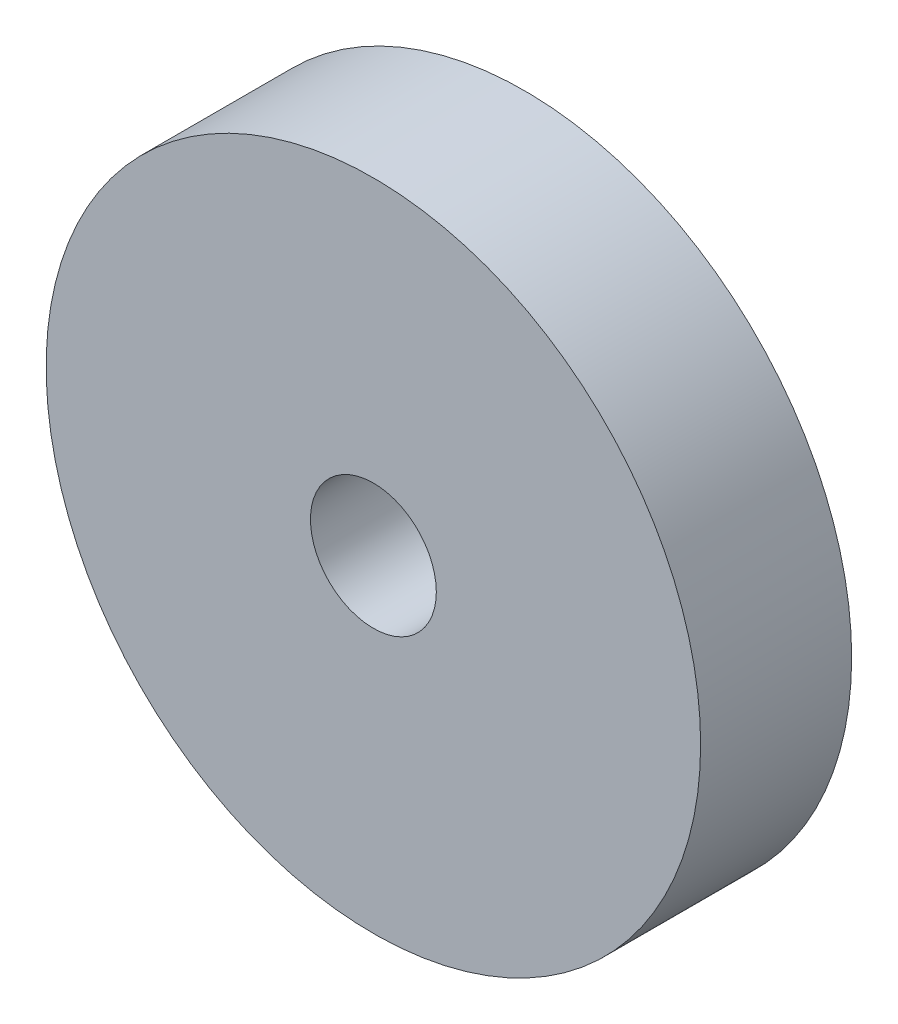
ISO-10303-21;
HEADER;
FILE_DESCRIPTION(('STEP AP214'),'2;1');
FILE_NAME('part.step','',(''),(''),'','','');
FILE_SCHEMA(('AUTOMOTIVE_DESIGN { 1 0 10303 214 1 1 1 1 }'));
ENDSEC;
DATA;
#1=APPLICATION_CONTEXT('core data for automotive mechanical design processes');
#2=APPLICATION_PROTOCOL_DEFINITION('international standard','automotive_design',2000,#1);
#3=PRODUCT_CONTEXT('',#1,'mechanical');
#4=PRODUCT('Part','Part','',(#3));
#5=PRODUCT_RELATED_PRODUCT_CATEGORY('part','',(#4));
#6=PRODUCT_DEFINITION_FORMATION('','',#4);
#7=PRODUCT_DEFINITION_CONTEXT('part definition',#1,'design');
#8=PRODUCT_DEFINITION('design','',#6,#7);
#9=PRODUCT_DEFINITION_SHAPE('','',#8);
#10=(LENGTH_UNIT() NAMED_UNIT(*) SI_UNIT(.MILLI.,.METRE.));
#11=(NAMED_UNIT(*) PLANE_ANGLE_UNIT() SI_UNIT($,.RADIAN.));
#12=(NAMED_UNIT(*) SI_UNIT($,.STERADIAN.) SOLID_ANGLE_UNIT());
#13=UNCERTAINTY_MEASURE_WITH_UNIT(LENGTH_MEASURE(1.E-05),#10,'distance_accuracy_value','');
#14=(GEOMETRIC_REPRESENTATION_CONTEXT(3) GLOBAL_UNCERTAINTY_ASSIGNED_CONTEXT((#13)) GLOBAL_UNIT_ASSIGNED_CONTEXT((#10,
#11,#12)) REPRESENTATION_CONTEXT('',''));
#15=CARTESIAN_POINT('',(0.,0.,0.));
#16=DIRECTION('',(0.,0.,1.));
#17=DIRECTION('',(1.,0.,0.));
#18=AXIS2_PLACEMENT_3D('',#15,#16,#17);
#19=CARTESIAN_POINT('',(0.,0.,3.));
#20=DIRECTION('',(0.,0.,1.));
#21=DIRECTION('',(1.,0.,0.));
#22=AXIS2_PLACEMENT_3D('',#19,#20,#21);
#23=PLANE('',#22);
#24=CARTESIAN_POINT('',(0.,0.,3.));
#25=DIRECTION('',(0.,0.,1.));
#26=DIRECTION('',(1.,0.,0.));
#27=AXIS2_PLACEMENT_3D('',#24,#25,#26);
#28=CIRCLE('',#27,6.5);
#29=CARTESIAN_POINT('',(6.5,0.,3.));
#30=VERTEX_POINT('',#29);
#31=EDGE_CURVE('E10',#30,#30,#28,.T.);
#32=ORIENTED_EDGE('',*,*,#31,.T.);
#33=EDGE_LOOP('',(#32));
#34=FACE_BOUND('',#33,.T.);
#35=CARTESIAN_POINT('',(0.,0.,3.));
#36=DIRECTION('',(0.,0.,1.));
#37=DIRECTION('',(1.,0.,0.));
#38=AXIS2_PLACEMENT_3D('',#35,#36,#37);
#39=CIRCLE('',#38,1.25);
#40=CARTESIAN_POINT('',(1.25,0.,3.));
#41=VERTEX_POINT('',#40);
#42=EDGE_CURVE('E44',#41,#41,#39,.T.);
#43=ORIENTED_EDGE('',*,*,#42,.F.);
#44=EDGE_LOOP('',(#43));
#45=FACE_BOUND('',#44,.T.);
#46=ADVANCED_FACE('F33',(#34,#45),#23,.T.);
#47=CARTESIAN_POINT('',(0.,0.,0.));
#48=DIRECTION('',(0.,0.,1.));
#49=DIRECTION('',(1.,0.,0.));
#50=AXIS2_PLACEMENT_3D('',#47,#48,#49);
#51=PLANE('',#50);
#52=CARTESIAN_POINT('',(0.,0.,0.));
#53=DIRECTION('',(0.,0.,1.));
#54=DIRECTION('',(1.,0.,0.));
#55=AXIS2_PLACEMENT_3D('',#52,#53,#54);
#56=CIRCLE('',#55,6.5);
#57=CARTESIAN_POINT('',(6.5,0.,0.));
#58=VERTEX_POINT('',#57);
#59=EDGE_CURVE('E37',#58,#58,#56,.T.);
#60=ORIENTED_EDGE('',*,*,#59,.F.);
#61=EDGE_LOOP('',(#60));
#62=FACE_BOUND('',#61,.T.);
#63=CARTESIAN_POINT('',(0.,0.,0.));
#64=DIRECTION('',(0.,0.,1.));
#65=DIRECTION('',(1.,0.,0.));
#66=AXIS2_PLACEMENT_3D('',#63,#64,#65);
#67=CIRCLE('',#66,1.25);
#68=CARTESIAN_POINT('',(1.25,0.,0.));
#69=VERTEX_POINT('',#68);
#70=EDGE_CURVE('E46',#69,#69,#67,.T.);
#71=ORIENTED_EDGE('',*,*,#70,.T.);
#72=EDGE_LOOP('',(#71));
#73=FACE_BOUND('',#72,.T.);
#74=ADVANCED_FACE('F56',(#62,#73),#51,.F.);
#75=CARTESIAN_POINT('',(0.,0.,3.));
#76=DIRECTION('',(0.,0.,-1.));
#77=DIRECTION('',(-1.,0.,0.));
#78=AXIS2_PLACEMENT_3D('',#75,#76,#77);
#79=CYLINDRICAL_SURFACE('',#78,6.5);
#80=ORIENTED_EDGE('',*,*,#31,.F.);
#81=EDGE_LOOP('',(#80));
#82=FACE_BOUND('',#81,.T.);
#83=ORIENTED_EDGE('',*,*,#59,.T.);
#84=EDGE_LOOP('',(#83));
#85=FACE_BOUND('',#84,.T.);
#86=ADVANCED_FACE('F35',(#82,#85),#79,.T.);
#87=CARTESIAN_POINT('',(0.,0.,3.));
#88=DIRECTION('',(0.,0.,-1.));
#89=DIRECTION('',(-1.,0.,0.));
#90=AXIS2_PLACEMENT_3D('',#87,#88,#89);
#91=CYLINDRICAL_SURFACE('',#90,1.25);
#92=ORIENTED_EDGE('',*,*,#42,.T.);
#93=EDGE_LOOP('',(#92));
#94=FACE_BOUND('',#93,.T.);
#95=ORIENTED_EDGE('',*,*,#70,.F.);
#96=EDGE_LOOP('',(#95));
#97=FACE_BOUND('',#96,.T.);
#98=ADVANCED_FACE('F52',(#94,#97),#91,.F.);
#99=CLOSED_SHELL('',(#46,#74,#86,#98));
#100=MANIFOLD_SOLID_BREP('B2',#99);
#101=ADVANCED_BREP_SHAPE_REPRESENTATION('',(#18,#100),#14);
#102=SHAPE_DEFINITION_REPRESENTATION(#9,#101);
ENDSEC;
END-ISO-10303-21;
